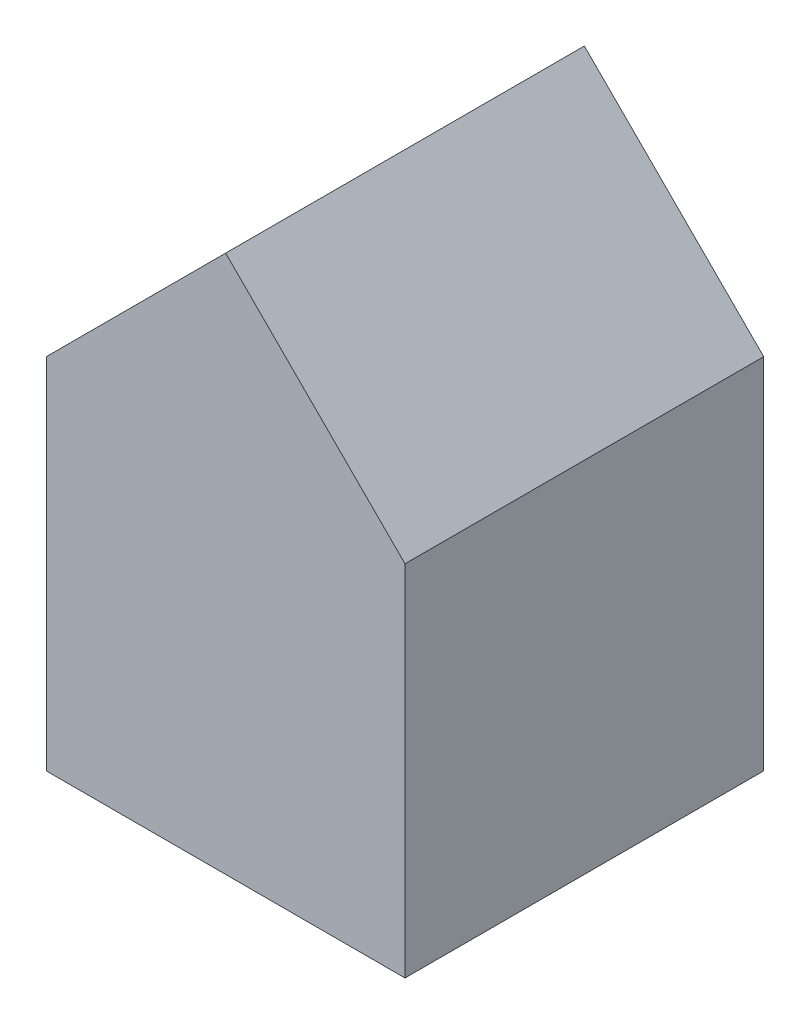
ISO-10303-21;
HEADER;
FILE_DESCRIPTION(('STEP AP214'),'2;1');
FILE_NAME('part.step','',(''),(''),'','','');
FILE_SCHEMA(('AUTOMOTIVE_DESIGN { 1 0 10303 214 1 1 1 1 }'));
ENDSEC;
DATA;
#1=APPLICATION_CONTEXT('core data for automotive mechanical design processes');
#2=APPLICATION_PROTOCOL_DEFINITION('international standard','automotive_design',2000,#1);
#3=PRODUCT_CONTEXT('',#1,'mechanical');
#4=PRODUCT('Part','Part','',(#3));
#5=PRODUCT_RELATED_PRODUCT_CATEGORY('part','',(#4));
#6=PRODUCT_DEFINITION_FORMATION('','',#4);
#7=PRODUCT_DEFINITION_CONTEXT('part definition',#1,'design');
#8=PRODUCT_DEFINITION('design','',#6,#7);
#9=PRODUCT_DEFINITION_SHAPE('','',#8);
#10=(LENGTH_UNIT() NAMED_UNIT(*) SI_UNIT(.MILLI.,.METRE.));
#11=(NAMED_UNIT(*) PLANE_ANGLE_UNIT() SI_UNIT($,.RADIAN.));
#12=(NAMED_UNIT(*) SI_UNIT($,.STERADIAN.) SOLID_ANGLE_UNIT());
#13=UNCERTAINTY_MEASURE_WITH_UNIT(LENGTH_MEASURE(1.E-05),#10,'distance_accuracy_value','');
#14=(GEOMETRIC_REPRESENTATION_CONTEXT(3) GLOBAL_UNCERTAINTY_ASSIGNED_CONTEXT((#13)) GLOBAL_UNIT_ASSIGNED_CONTEXT((#10,
#11,#12)) REPRESENTATION_CONTEXT('',''));
#15=CARTESIAN_POINT('',(0.,0.,0.));
#16=DIRECTION('',(0.,0.,1.));
#17=DIRECTION('',(1.,0.,0.));
#18=AXIS2_PLACEMENT_3D('',#15,#16,#17);
#19=CARTESIAN_POINT('',(0.,10.,10.));
#20=DIRECTION('',(1.,0.,0.));
#21=DIRECTION('',(0.,1.,0.));
#22=AXIS2_PLACEMENT_3D('',#19,#20,#21);
#23=PLANE('',#22);
#24=DIRECTION('',(0.,-1.,0.));
#25=VECTOR('',#24,1.);
#26=CARTESIAN_POINT('',(0.,10.,0.));
#27=LINE('',#26,#25);
#28=CARTESIAN_POINT('',(0.,10.,0.));
#29=VERTEX_POINT('',#28);
#30=CARTESIAN_POINT('',(0.,0.,0.));
#31=VERTEX_POINT('',#30);
#32=EDGE_CURVE('E106',#29,#31,#27,.T.);
#33=ORIENTED_EDGE('',*,*,#32,.T.);
#34=DIRECTION('',(0.,0.,-1.));
#35=VECTOR('',#34,1.);
#36=CARTESIAN_POINT('',(0.,0.,10.));
#37=LINE('',#36,#35);
#38=CARTESIAN_POINT('',(0.,0.,10.));
#39=VERTEX_POINT('',#38);
#40=EDGE_CURVE('E11',#39,#31,#37,.T.);
#41=ORIENTED_EDGE('',*,*,#40,.F.);
#42=DIRECTION('',(0.,-1.,0.));
#43=VECTOR('',#42,1.);
#44=CARTESIAN_POINT('',(0.,10.,10.));
#45=LINE('',#44,#43);
#46=CARTESIAN_POINT('',(0.,10.,10.));
#47=VERTEX_POINT('',#46);
#48=EDGE_CURVE('E114',#47,#39,#45,.T.);
#49=ORIENTED_EDGE('',*,*,#48,.F.);
#50=DIRECTION('',(0.,0.,-1.));
#51=VECTOR('',#50,1.);
#52=CARTESIAN_POINT('',(0.,10.,10.));
#53=LINE('',#52,#51);
#54=EDGE_CURVE('E102',#47,#29,#53,.T.);
#55=ORIENTED_EDGE('',*,*,#54,.T.);
#56=EDGE_LOOP('',(#33,#41,#49,#55));
#57=FACE_BOUND('',#56,.T.);
#58=ADVANCED_FACE('F32',(#57),#23,.F.);
#59=CARTESIAN_POINT('',(0.,0.,10.));
#60=DIRECTION('',(0.,1.,0.));
#61=DIRECTION('',(0.,0.,1.));
#62=AXIS2_PLACEMENT_3D('',#59,#60,#61);
#63=PLANE('',#62);
#64=DIRECTION('',(1.,0.,0.));
#65=VECTOR('',#64,1.);
#66=CARTESIAN_POINT('',(0.,0.,0.));
#67=LINE('',#66,#65);
#68=CARTESIAN_POINT('',(10.,0.,0.));
#69=VERTEX_POINT('',#68);
#70=EDGE_CURVE('E109',#31,#69,#67,.T.);
#71=ORIENTED_EDGE('',*,*,#70,.T.);
#72=DIRECTION('',(0.,0.,-1.));
#73=VECTOR('',#72,1.);
#74=CARTESIAN_POINT('',(10.,0.,10.));
#75=LINE('',#74,#73);
#76=CARTESIAN_POINT('',(10.,0.,10.));
#77=VERTEX_POINT('',#76);
#78=EDGE_CURVE('E40',#77,#69,#75,.T.);
#79=ORIENTED_EDGE('',*,*,#78,.F.);
#80=DIRECTION('',(1.,0.,0.));
#81=VECTOR('',#80,1.);
#82=CARTESIAN_POINT('',(0.,0.,10.));
#83=LINE('',#82,#81);
#84=EDGE_CURVE('E82',#39,#77,#83,.T.);
#85=ORIENTED_EDGE('',*,*,#84,.F.);
#86=ORIENTED_EDGE('',*,*,#40,.T.);
#87=EDGE_LOOP('',(#71,#79,#85,#86));
#88=FACE_BOUND('',#87,.T.);
#89=ADVANCED_FACE('F133',(#88),#63,.F.);
#90=CARTESIAN_POINT('',(10.,0.,10.));
#91=DIRECTION('',(-1.,0.,0.));
#92=DIRECTION('',(0.,0.,1.));
#93=AXIS2_PLACEMENT_3D('',#90,#91,#92);
#94=PLANE('',#93);
#95=DIRECTION('',(0.,1.,0.));
#96=VECTOR('',#95,1.);
#97=CARTESIAN_POINT('',(10.,0.,0.));
#98=LINE('',#97,#96);
#99=CARTESIAN_POINT('',(10.,10.,0.));
#100=VERTEX_POINT('',#99);
#101=EDGE_CURVE('E97',#69,#100,#98,.T.);
#102=ORIENTED_EDGE('',*,*,#101,.T.);
#103=DIRECTION('',(0.,0.,-1.));
#104=VECTOR('',#103,1.);
#105=CARTESIAN_POINT('',(10.,10.,10.));
#106=LINE('',#105,#104);
#107=CARTESIAN_POINT('',(10.,10.,10.));
#108=VERTEX_POINT('',#107);
#109=EDGE_CURVE('E94',#108,#100,#106,.T.);
#110=ORIENTED_EDGE('',*,*,#109,.F.);
#111=DIRECTION('',(0.,1.,0.));
#112=VECTOR('',#111,1.);
#113=CARTESIAN_POINT('',(10.,0.,10.));
#114=LINE('',#113,#112);
#115=EDGE_CURVE('E86',#77,#108,#114,.T.);
#116=ORIENTED_EDGE('',*,*,#115,.F.);
#117=ORIENTED_EDGE('',*,*,#78,.T.);
#118=EDGE_LOOP('',(#102,#110,#116,#117));
#119=FACE_BOUND('',#118,.T.);
#120=ADVANCED_FACE('F95',(#119),#94,.F.);
#121=CARTESIAN_POINT('',(10.,10.,10.));
#122=DIRECTION('',(-0.707106781186549,-0.707106781186547,0.));
#123=DIRECTION('',(0.707106781186547,-0.707106781186549,0.));
#124=AXIS2_PLACEMENT_3D('',#121,#122,#123);
#125=PLANE('',#124);
#126=DIRECTION('',(-0.707106781186547,0.707106781186549,0.));
#127=VECTOR('',#126,1.);
#128=CARTESIAN_POINT('',(10.,10.,0.));
#129=LINE('',#128,#127);
#130=CARTESIAN_POINT('',(5.,15.,0.));
#131=VERTEX_POINT('',#130);
#132=EDGE_CURVE('E68',#100,#131,#129,.T.);
#133=ORIENTED_EDGE('',*,*,#132,.T.);
#134=DIRECTION('',(0.,0.,-1.));
#135=VECTOR('',#134,1.);
#136=CARTESIAN_POINT('',(5.,15.,10.));
#137=LINE('',#136,#135);
#138=CARTESIAN_POINT('',(5.,15.,10.));
#139=VERTEX_POINT('',#138);
#140=EDGE_CURVE('E98',#139,#131,#137,.T.);
#141=ORIENTED_EDGE('',*,*,#140,.F.);
#142=DIRECTION('',(-0.707106781186547,0.707106781186549,0.));
#143=VECTOR('',#142,1.);
#144=CARTESIAN_POINT('',(10.,10.,10.));
#145=LINE('',#144,#143);
#146=EDGE_CURVE('E90',#108,#139,#145,.T.);
#147=ORIENTED_EDGE('',*,*,#146,.F.);
#148=ORIENTED_EDGE('',*,*,#109,.T.);
#149=EDGE_LOOP('',(#133,#141,#147,#148));
#150=FACE_BOUND('',#149,.T.);
#151=ADVANCED_FACE('F100',(#150),#125,.F.);
#152=CARTESIAN_POINT('',(5.,15.,10.));
#153=DIRECTION('',(0.707106781186549,-0.707106781186546,0.));
#154=DIRECTION('',(0.707106781186546,0.707106781186549,0.));
#155=AXIS2_PLACEMENT_3D('',#152,#153,#154);
#156=PLANE('',#155);
#157=DIRECTION('',(-0.707106781186546,-0.707106781186549,0.));
#158=VECTOR('',#157,1.);
#159=CARTESIAN_POINT('',(5.,15.,0.));
#160=LINE('',#159,#158);
#161=EDGE_CURVE('E74',#131,#29,#160,.T.);
#162=ORIENTED_EDGE('',*,*,#161,.T.);
#163=ORIENTED_EDGE('',*,*,#54,.F.);
#164=DIRECTION('',(-0.707106781186546,-0.707106781186549,0.));
#165=VECTOR('',#164,1.);
#166=CARTESIAN_POINT('',(5.,15.,10.));
#167=LINE('',#166,#165);
#168=EDGE_CURVE('E48',#139,#47,#167,.T.);
#169=ORIENTED_EDGE('',*,*,#168,.F.);
#170=ORIENTED_EDGE('',*,*,#140,.T.);
#171=EDGE_LOOP('',(#162,#163,#169,#170));
#172=FACE_BOUND('',#171,.T.);
#173=ADVANCED_FACE('F122',(#172),#156,.F.);
#174=CARTESIAN_POINT('',(0.,0.,10.));
#175=DIRECTION('',(0.,0.,1.));
#176=DIRECTION('',(1.,0.,0.));
#177=AXIS2_PLACEMENT_3D('',#174,#175,#176);
#178=PLANE('',#177);
#179=ORIENTED_EDGE('',*,*,#48,.T.);
#180=ORIENTED_EDGE('',*,*,#84,.T.);
#181=ORIENTED_EDGE('',*,*,#115,.T.);
#182=ORIENTED_EDGE('',*,*,#146,.T.);
#183=ORIENTED_EDGE('',*,*,#168,.T.);
#184=EDGE_LOOP('',(#179,#180,#181,#182,#183));
#185=FACE_BOUND('',#184,.T.);
#186=ADVANCED_FACE('F88',(#185),#178,.T.);
#187=CARTESIAN_POINT('',(0.,0.,0.));
#188=DIRECTION('',(0.,0.,1.));
#189=DIRECTION('',(1.,0.,0.));
#190=AXIS2_PLACEMENT_3D('',#187,#188,#189);
#191=PLANE('',#190);
#192=ORIENTED_EDGE('',*,*,#32,.F.);
#193=ORIENTED_EDGE('',*,*,#161,.F.);
#194=ORIENTED_EDGE('',*,*,#132,.F.);
#195=ORIENTED_EDGE('',*,*,#101,.F.);
#196=ORIENTED_EDGE('',*,*,#70,.F.);
#197=EDGE_LOOP('',(#192,#193,#194,#195,#196));
#198=FACE_BOUND('',#197,.T.);
#199=ADVANCED_FACE('F118',(#198),#191,.F.);
#200=CLOSED_SHELL('',(#58,#89,#120,#151,#173,#186,#199));
#201=MANIFOLD_SOLID_BREP('B2',#200);
#202=ADVANCED_BREP_SHAPE_REPRESENTATION('',(#18,#201),#14);
#203=SHAPE_DEFINITION_REPRESENTATION(#9,#202);
ENDSEC;
END-ISO-10303-21;
